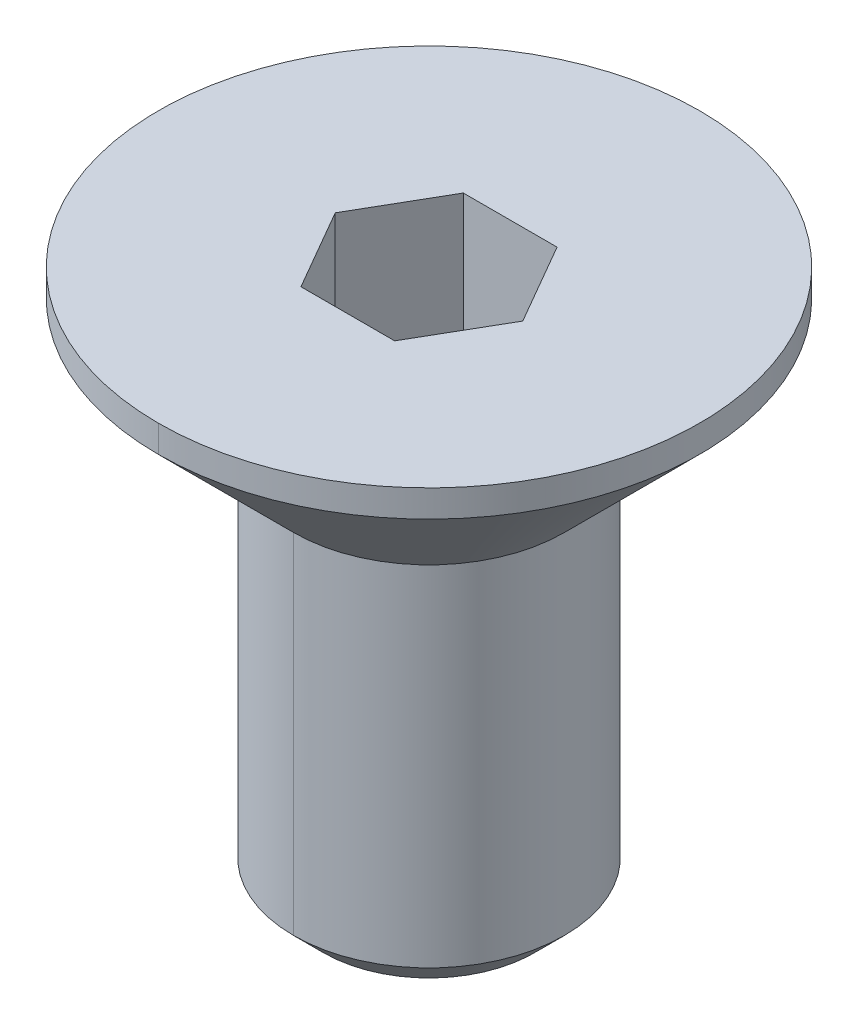
ISO-10303-21;
HEADER;
FILE_DESCRIPTION(('STEP AP214'),'2;1');
FILE_NAME('part.step','',(''),(''),'','','');
FILE_SCHEMA(('AUTOMOTIVE_DESIGN { 1 0 10303 214 1 1 1 1 }'));
ENDSEC;
DATA;
#1=APPLICATION_CONTEXT('core data for automotive mechanical design processes');
#2=APPLICATION_PROTOCOL_DEFINITION('international standard','automotive_design',2000,#1);
#3=PRODUCT_CONTEXT('',#1,'mechanical');
#4=PRODUCT('Part','Part','',(#3));
#5=PRODUCT_RELATED_PRODUCT_CATEGORY('part','',(#4));
#6=PRODUCT_DEFINITION_FORMATION('','',#4);
#7=PRODUCT_DEFINITION_CONTEXT('part definition',#1,'design');
#8=PRODUCT_DEFINITION('design','',#6,#7);
#9=PRODUCT_DEFINITION_SHAPE('','',#8);
#10=(LENGTH_UNIT() NAMED_UNIT(*) SI_UNIT(.MILLI.,.METRE.));
#11=(NAMED_UNIT(*) PLANE_ANGLE_UNIT() SI_UNIT($,.RADIAN.));
#12=(NAMED_UNIT(*) SI_UNIT($,.STERADIAN.) SOLID_ANGLE_UNIT());
#13=UNCERTAINTY_MEASURE_WITH_UNIT(LENGTH_MEASURE(1.E-05),#10,'distance_accuracy_value','');
#14=(GEOMETRIC_REPRESENTATION_CONTEXT(3) GLOBAL_UNCERTAINTY_ASSIGNED_CONTEXT((#13)) GLOBAL_UNIT_ASSIGNED_CONTEXT((#10,
#11,#12)) REPRESENTATION_CONTEXT('',''));
#15=CARTESIAN_POINT('',(0.,0.,0.));
#16=DIRECTION('',(0.,0.,1.));
#17=DIRECTION('',(1.,0.,0.));
#18=AXIS2_PLACEMENT_3D('',#15,#16,#17);
#19=CARTESIAN_POINT('',(9.875,143.526049999998,17.1040017247427));
#20=DIRECTION('',(0.,1.,0.));
#21=DIRECTION('',(0.,0.,-1.));
#22=AXIS2_PLACEMENT_3D('',#19,#20,#21);
#23=CYLINDRICAL_SURFACE('',#22,2.5);
#24=CARTESIAN_POINT('',(9.875,148.276049999998,17.1040017247427));
#25=DIRECTION('',(0.,1.,0.));
#26=DIRECTION('',(0.,0.,-1.));
#27=AXIS2_PLACEMENT_3D('',#24,#25,#26);
#28=CIRCLE('',#27,2.5);
#29=CARTESIAN_POINT('',(9.875,148.276049999998,14.6040017247426));
#30=VERTEX_POINT('',#29);
#31=CARTESIAN_POINT('',(9.875,148.276049999998,19.6040017247427));
#32=VERTEX_POINT('',#31);
#33=EDGE_CURVE('E240',#30,#32,#28,.T.);
#34=ORIENTED_EDGE('',*,*,#33,.T.);
#35=DIRECTION('',(0.,1.,0.));
#36=VECTOR('',#35,1.);
#37=CARTESIAN_POINT('',(9.875,143.526049999998,19.6040017247427));
#38=LINE('',#37,#36);
#39=CARTESIAN_POINT('',(9.875,148.526049999998,19.6040017247427));
#40=VERTEX_POINT('',#39);
#41=EDGE_CURVE('E224',#32,#40,#38,.T.);
#42=ORIENTED_EDGE('',*,*,#41,.T.);
#43=CARTESIAN_POINT('',(9.875,148.526049999998,17.1040017247427));
#44=DIRECTION('',(0.,1.,0.));
#45=DIRECTION('',(0.,0.,-1.));
#46=AXIS2_PLACEMENT_3D('',#43,#44,#45);
#47=CIRCLE('',#46,2.5);
#48=CARTESIAN_POINT('',(9.875,148.526049999998,14.6040017247426));
#49=VERTEX_POINT('',#48);
#50=EDGE_CURVE('E210',#49,#40,#47,.T.);
#51=ORIENTED_EDGE('',*,*,#50,.F.);
#52=DIRECTION('',(0.,1.,0.));
#53=VECTOR('',#52,1.);
#54=CARTESIAN_POINT('',(9.875,143.526049999998,14.6040017247426));
#55=LINE('',#54,#53);
#56=EDGE_CURVE('E236',#30,#49,#55,.T.);
#57=ORIENTED_EDGE('',*,*,#56,.F.);
#58=EDGE_LOOP('',(#34,#42,#51,#57));
#59=FACE_BOUND('',#58,.T.);
#60=ADVANCED_FACE('F17',(#59),#23,.T.);
#61=CARTESIAN_POINT('',(9.875,148.276049999998,17.1040017247427));
#62=DIRECTION('',(0.,1.,0.));
#63=DIRECTION('',(0.,0.,1.));
#64=AXIS2_PLACEMENT_3D('',#61,#62,#63);
#65=CONICAL_SURFACE('',#64,2.5,0.785398163397449);
#66=CARTESIAN_POINT('',(9.875,147.026049999998,17.1040017247427));
#67=DIRECTION('',(0.,1.,0.));
#68=DIRECTION('',(0.,0.,-1.));
#69=AXIS2_PLACEMENT_3D('',#66,#67,#68);
#70=CIRCLE('',#69,1.25);
#71=CARTESIAN_POINT('',(9.875,147.026049999998,18.3540017247426));
#72=VERTEX_POINT('',#71);
#73=CARTESIAN_POINT('',(9.875,147.026049999998,15.8540017247427));
#74=VERTEX_POINT('',#73);
#75=EDGE_CURVE('E265',#72,#74,#70,.T.);
#76=ORIENTED_EDGE('',*,*,#75,.T.);
#77=DIRECTION('',(0.,0.707106781186548,-0.707106781186548));
#78=VECTOR('',#77,1.);
#79=CARTESIAN_POINT('',(9.875,148.276049999998,14.6040017247426));
#80=LINE('',#79,#78);
#81=EDGE_CURVE('E239',#74,#30,#80,.T.);
#82=ORIENTED_EDGE('',*,*,#81,.T.);
#83=CARTESIAN_POINT('',(9.875,148.276049999998,17.1040017247427));
#84=DIRECTION('',(0.,1.,0.));
#85=DIRECTION('',(0.,0.,-1.));
#86=AXIS2_PLACEMENT_3D('',#83,#84,#85);
#87=CIRCLE('',#86,2.5);
#88=EDGE_CURVE('E228',#32,#30,#87,.T.);
#89=ORIENTED_EDGE('',*,*,#88,.F.);
#90=DIRECTION('',(0.,0.707106781186547,0.707106781186549));
#91=VECTOR('',#90,1.);
#92=CARTESIAN_POINT('',(9.875,148.276049999998,19.6040017247427));
#93=LINE('',#92,#91);
#94=EDGE_CURVE('E244',#72,#32,#93,.T.);
#95=ORIENTED_EDGE('',*,*,#94,.F.);
#96=EDGE_LOOP('',(#76,#82,#89,#95));
#97=FACE_BOUND('',#96,.T.);
#98=ADVANCED_FACE('F700',(#97),#65,.T.);
#99=CARTESIAN_POINT('',(9.875,143.526049999998,17.1040017247427));
#100=DIRECTION('',(0.,1.,0.));
#101=DIRECTION('',(0.,0.,-1.));
#102=AXIS2_PLACEMENT_3D('',#99,#100,#101);
#103=CYLINDRICAL_SURFACE('',#102,1.25);
#104=CARTESIAN_POINT('',(9.875,143.802049999998,17.1040017247427));
#105=DIRECTION('',(0.,1.,0.));
#106=DIRECTION('',(0.,0.,-1.));
#107=AXIS2_PLACEMENT_3D('',#104,#105,#106);
#108=CIRCLE('',#107,1.25);
#109=CARTESIAN_POINT('',(9.875,143.802049999998,15.8540017247427));
#110=VERTEX_POINT('',#109);
#111=CARTESIAN_POINT('',(9.875,143.802049999998,18.3540017247426));
#112=VERTEX_POINT('',#111);
#113=EDGE_CURVE('E280',#110,#112,#108,.T.);
#114=ORIENTED_EDGE('',*,*,#113,.T.);
#115=DIRECTION('',(0.,1.,0.));
#116=VECTOR('',#115,1.);
#117=CARTESIAN_POINT('',(9.875,143.526049999998,18.3540017247426));
#118=LINE('',#117,#116);
#119=EDGE_CURVE('E243',#112,#72,#118,.T.);
#120=ORIENTED_EDGE('',*,*,#119,.T.);
#121=CARTESIAN_POINT('',(9.875,147.026049999998,17.1040017247427));
#122=DIRECTION('',(0.,1.,0.));
#123=DIRECTION('',(0.,0.,-1.));
#124=AXIS2_PLACEMENT_3D('',#121,#122,#123);
#125=CIRCLE('',#124,1.25);
#126=EDGE_CURVE('E245',#74,#72,#125,.T.);
#127=ORIENTED_EDGE('',*,*,#126,.F.);
#128=DIRECTION('',(0.,1.,0.));
#129=VECTOR('',#128,1.);
#130=CARTESIAN_POINT('',(9.875,143.526049999998,15.8540017247427));
#131=LINE('',#130,#129);
#132=EDGE_CURVE('E261',#110,#74,#131,.T.);
#133=ORIENTED_EDGE('',*,*,#132,.F.);
#134=EDGE_LOOP('',(#114,#120,#127,#133));
#135=FACE_BOUND('',#134,.T.);
#136=ADVANCED_FACE('F691',(#135),#103,.T.);
#137=CARTESIAN_POINT('',(9.875,143.802049999998,17.1040017247427));
#138=DIRECTION('',(0.,1.,0.));
#139=DIRECTION('',(0.,0.,1.));
#140=AXIS2_PLACEMENT_3D('',#137,#138,#139);
#141=CONICAL_SURFACE('',#140,1.25,0.785398163397449);
#142=CARTESIAN_POINT('',(9.875,143.526049999998,17.1040017247427));
#143=DIRECTION('',(0.,1.,0.));
#144=DIRECTION('',(0.,0.,-1.));
#145=AXIS2_PLACEMENT_3D('',#142,#143,#144);
#146=CIRCLE('',#145,0.974);
#147=CARTESIAN_POINT('',(9.875,143.526049999998,18.0780017247427));
#148=VERTEX_POINT('',#147);
#149=CARTESIAN_POINT('',(9.875,143.526049999998,16.1300017247426));
#150=VERTEX_POINT('',#149);
#151=EDGE_CURVE('E283',#148,#150,#146,.T.);
#152=ORIENTED_EDGE('',*,*,#151,.T.);
#153=DIRECTION('',(0.,0.707106781186548,-0.707106781186548));
#154=VECTOR('',#153,1.);
#155=CARTESIAN_POINT('',(9.875,143.802049999998,15.8540017247427));
#156=LINE('',#155,#154);
#157=EDGE_CURVE('E268',#150,#110,#156,.T.);
#158=ORIENTED_EDGE('',*,*,#157,.T.);
#159=CARTESIAN_POINT('',(9.875,143.802049999998,17.1040017247427));
#160=DIRECTION('',(0.,1.,0.));
#161=DIRECTION('',(0.,0.,-1.));
#162=AXIS2_PLACEMENT_3D('',#159,#160,#161);
#163=CIRCLE('',#162,1.25);
#164=EDGE_CURVE('E257',#112,#110,#163,.T.);
#165=ORIENTED_EDGE('',*,*,#164,.F.);
#166=DIRECTION('',(0.,0.707106781186547,0.707106781186549));
#167=VECTOR('',#166,1.);
#168=CARTESIAN_POINT('',(9.875,143.802049999998,18.3540017247426));
#169=LINE('',#168,#167);
#170=EDGE_CURVE('E276',#148,#112,#169,.T.);
#171=ORIENTED_EDGE('',*,*,#170,.F.);
#172=EDGE_LOOP('',(#152,#158,#165,#171));
#173=FACE_BOUND('',#172,.T.);
#174=ADVANCED_FACE('F683',(#173),#141,.T.);
#175=CARTESIAN_POINT('',(9.875,405.845095102518,17.1040017247429));
#176=DIRECTION('',(0.,1.,0.));
#177=DIRECTION('',(0.,0.,1.));
#178=AXIS2_PLACEMENT_3D('',#175,#176,#177);
#179=CONICAL_SURFACE('',#178,965.925826289068,1.30899693899575);
#180=DIRECTION('',(0.,0.258819045102518,0.965925826289069));
#181=VECTOR('',#180,1.);
#182=CARTESIAN_POINT('',(9.875,405.845095102518,983.029828013811));
#183=LINE('',#182,#181);
#184=CARTESIAN_POINT('',(9.875,147.026049999998,17.1040017247427));
#185=VERTEX_POINT('',#184);
#186=CARTESIAN_POINT('',(9.875,147.227011894321,17.8540017247426));
#187=VERTEX_POINT('',#186);
#188=EDGE_CURVE('E38',#185,#187,#183,.T.);
#189=ORIENTED_EDGE('',*,*,#188,.F.);
#190=DIRECTION('',(0.,0.258819045102519,-0.965925826289069));
#191=VECTOR('',#190,1.);
#192=CARTESIAN_POINT('',(9.875,405.84509510252,-948.821824564325));
#193=LINE('',#192,#191);
#194=CARTESIAN_POINT('',(9.875,147.227011894321,16.3540017247427));
#195=VERTEX_POINT('',#194);
#196=EDGE_CURVE('E308',#185,#195,#193,.T.);
#197=ORIENTED_EDGE('',*,*,#196,.T.);
#198=CARTESIAN_POINT('',(9.875,147.227011894321,17.1040017247427));
#199=DIRECTION('',(0.,1.,0.));
#200=DIRECTION('',(0.,0.,-1.));
#201=AXIS2_PLACEMENT_3D('',#198,#199,#200);
#202=CIRCLE('',#201,0.75);
#203=CARTESIAN_POINT('',(9.22548094716169,147.227011894321,16.7290017247427));
#204=VERTEX_POINT('',#203);
#205=EDGE_CURVE('E11',#195,#204,#202,.T.);
#206=ORIENTED_EDGE('',*,*,#205,.T.);
#207=CARTESIAN_POINT('',(9.875,147.227011894321,17.1040017247427));
#208=DIRECTION('',(0.,1.,0.));
#209=DIRECTION('',(0.,0.,-1.));
#210=AXIS2_PLACEMENT_3D('',#207,#208,#209);
#211=CIRCLE('',#210,0.75);
#212=CARTESIAN_POINT('',(9.22548094716169,147.227011894321,17.4790017247427));
#213=VERTEX_POINT('',#212);
#214=EDGE_CURVE('E201',#204,#213,#211,.T.);
#215=ORIENTED_EDGE('',*,*,#214,.T.);
#216=CARTESIAN_POINT('',(9.875,147.227011894321,17.1040017247427));
#217=DIRECTION('',(0.,1.,0.));
#218=DIRECTION('',(0.,0.,-1.));
#219=AXIS2_PLACEMENT_3D('',#216,#217,#218);
#220=CIRCLE('',#219,0.75);
#221=EDGE_CURVE('E345',#213,#187,#220,.T.);
#222=ORIENTED_EDGE('',*,*,#221,.T.);
#223=EDGE_LOOP('',(#189,#197,#206,#215,#222));
#224=FACE_BOUND('',#223,.T.);
#225=ADVANCED_FACE('F317',(#224),#179,.F.);
#226=CARTESIAN_POINT('',(9.875,147.227011894321,17.1040017247427));
#227=DIRECTION('',(0.,-1.,0.));
#228=DIRECTION('',(0.,0.,-1.));
#229=AXIS2_PLACEMENT_3D('',#226,#227,#228);
#230=PLANE('',#229);
#231=DIRECTION('',(-0.5,0.,-0.866025403784439));
#232=VECTOR('',#231,1.);
#233=CARTESIAN_POINT('',(10.7410254037845,147.227011894321,17.1040017247427));
#234=LINE('',#233,#232);
#235=CARTESIAN_POINT('',(10.7410254037845,147.227011894321,17.1040017247427));
#236=VERTEX_POINT('',#235);
#237=CARTESIAN_POINT('',(10.5245190528383,147.227011894321,16.7290017247427));
#238=VERTEX_POINT('',#237);
#239=EDGE_CURVE('E166',#236,#238,#234,.T.);
#240=ORIENTED_EDGE('',*,*,#239,.T.);
#241=CARTESIAN_POINT('',(9.875,147.227011894321,17.1040017247427));
#242=DIRECTION('',(0.,1.,0.));
#243=DIRECTION('',(0.,0.,-1.));
#244=AXIS2_PLACEMENT_3D('',#241,#242,#243);
#245=CIRCLE('',#244,0.75);
#246=CARTESIAN_POINT('',(10.5245190528383,147.227011894321,17.4790017247427));
#247=VERTEX_POINT('',#246);
#248=EDGE_CURVE('E161',#247,#238,#245,.T.);
#249=ORIENTED_EDGE('',*,*,#248,.F.);
#250=DIRECTION('',(0.5,0.,-0.866025403784439));
#251=VECTOR('',#250,1.);
#252=CARTESIAN_POINT('',(10.3080127018922,147.227011894321,17.8540017247426));
#253=LINE('',#252,#251);
#254=EDGE_CURVE('E164',#247,#236,#253,.T.);
#255=ORIENTED_EDGE('',*,*,#254,.T.);
#256=EDGE_LOOP('',(#240,#249,#255));
#257=FACE_BOUND('',#256,.T.);
#258=ADVANCED_FACE('F163',(#257),#230,.F.);
#259=CARTESIAN_POINT('',(9.875,147.227011894321,17.1040017247427));
#260=DIRECTION('',(0.,-1.,0.));
#261=DIRECTION('',(0.,0.,-1.));
#262=AXIS2_PLACEMENT_3D('',#259,#260,#261);
#263=PLANE('',#262);
#264=DIRECTION('',(-1.,0.,0.));
#265=VECTOR('',#264,1.);
#266=CARTESIAN_POINT('',(10.3080127018922,147.227011894321,16.3540017247427));
#267=LINE('',#266,#265);
#268=CARTESIAN_POINT('',(10.3080127018922,147.227011894321,16.3540017247427));
#269=VERTEX_POINT('',#268);
#270=EDGE_CURVE('E300',#269,#195,#267,.T.);
#271=ORIENTED_EDGE('',*,*,#270,.T.);
#272=CARTESIAN_POINT('',(9.875,147.227011894321,17.1040017247427));
#273=DIRECTION('',(0.,1.,0.));
#274=DIRECTION('',(0.,0.,-1.));
#275=AXIS2_PLACEMENT_3D('',#272,#273,#274);
#276=CIRCLE('',#275,0.75);
#277=EDGE_CURVE('E25',#238,#195,#276,.T.);
#278=ORIENTED_EDGE('',*,*,#277,.F.);
#279=DIRECTION('',(-0.5,0.,-0.866025403784439));
#280=VECTOR('',#279,1.);
#281=CARTESIAN_POINT('',(10.7410254037845,147.227011894321,17.1040017247427));
#282=LINE('',#281,#280);
#283=EDGE_CURVE('E296',#238,#269,#282,.T.);
#284=ORIENTED_EDGE('',*,*,#283,.T.);
#285=EDGE_LOOP('',(#271,#278,#284));
#286=FACE_BOUND('',#285,.T.);
#287=ADVANCED_FACE('F323',(#286),#263,.F.);
#288=CARTESIAN_POINT('',(9.875,147.227011894321,17.1040017247427));
#289=DIRECTION('',(0.,-1.,0.));
#290=DIRECTION('',(0.,0.,-1.));
#291=AXIS2_PLACEMENT_3D('',#288,#289,#290);
#292=PLANE('',#291);
#293=DIRECTION('',(-0.5,0.,0.866025403784439));
#294=VECTOR('',#293,1.);
#295=CARTESIAN_POINT('',(9.4419872981078,147.227011894321,16.3540017247427));
#296=LINE('',#295,#294);
#297=CARTESIAN_POINT('',(9.4419872981078,147.227011894321,16.3540017247427));
#298=VERTEX_POINT('',#297);
#299=EDGE_CURVE('E49',#298,#204,#296,.T.);
#300=ORIENTED_EDGE('',*,*,#299,.T.);
#301=ORIENTED_EDGE('',*,*,#205,.F.);
#302=DIRECTION('',(-1.,0.,0.));
#303=VECTOR('',#302,1.);
#304=CARTESIAN_POINT('',(10.3080127018922,147.227011894321,16.3540017247427));
#305=LINE('',#304,#303);
#306=EDGE_CURVE('E211',#195,#298,#305,.T.);
#307=ORIENTED_EDGE('',*,*,#306,.T.);
#308=EDGE_LOOP('',(#300,#301,#307));
#309=FACE_BOUND('',#308,.T.);
#310=ADVANCED_FACE('F593',(#309),#292,.F.);
#311=CARTESIAN_POINT('',(9.875,405.845095102518,17.1040017247429));
#312=DIRECTION('',(0.,1.,0.));
#313=DIRECTION('',(0.,0.,1.));
#314=AXIS2_PLACEMENT_3D('',#311,#312,#313);
#315=CONICAL_SURFACE('',#314,965.925826289068,1.30899693899575);
#316=ORIENTED_EDGE('',*,*,#196,.F.);
#317=ORIENTED_EDGE('',*,*,#188,.T.);
#318=CARTESIAN_POINT('',(9.875,147.227011894321,17.1040017247427));
#319=DIRECTION('',(0.,1.,0.));
#320=DIRECTION('',(0.,0.,-1.));
#321=AXIS2_PLACEMENT_3D('',#318,#319,#320);
#322=CIRCLE('',#321,0.75);
#323=EDGE_CURVE('E183',#187,#247,#322,.T.);
#324=ORIENTED_EDGE('',*,*,#323,.T.);
#325=ORIENTED_EDGE('',*,*,#248,.T.);
#326=ORIENTED_EDGE('',*,*,#277,.T.);
#327=EDGE_LOOP('',(#316,#317,#324,#325,#326));
#328=FACE_BOUND('',#327,.T.);
#329=ADVANCED_FACE('F184',(#328),#315,.F.);
#330=CARTESIAN_POINT('',(9.00897459621558,147.227011894321,17.1040017247427));
#331=DIRECTION('',(0.866025403784439,0.,-0.5));
#332=DIRECTION('',(0.,-1.,0.));
#333=AXIS2_PLACEMENT_3D('',#330,#331,#332);
#334=PLANE('',#333);
#335=DIRECTION('',(0.5,0.,0.866025403784439));
#336=VECTOR('',#335,1.);
#337=CARTESIAN_POINT('',(9.00897459621558,147.227011894321,17.1040017247427));
#338=LINE('',#337,#336);
#339=CARTESIAN_POINT('',(9.00897459621558,147.227011894321,17.1040017247427));
#340=VERTEX_POINT('',#339);
#341=EDGE_CURVE('E359',#340,#213,#338,.T.);
#342=ORIENTED_EDGE('',*,*,#341,.F.);
#343=DIRECTION('',(0.,1.,0.));
#344=VECTOR('',#343,1.);
#345=CARTESIAN_POINT('',(9.00897459621558,147.227011894321,17.1040017247427));
#346=LINE('',#345,#344);
#347=CARTESIAN_POINT('',(9.00897459621558,148.526049999998,17.1040017247427));
#348=VERTEX_POINT('',#347);
#349=EDGE_CURVE('E286',#340,#348,#346,.T.);
#350=ORIENTED_EDGE('',*,*,#349,.T.);
#351=DIRECTION('',(-0.5,0.,-0.866025403784439));
#352=VECTOR('',#351,1.);
#353=CARTESIAN_POINT('',(9.03798094716169,148.526049999998,17.1542421983235));
#354=LINE('',#353,#352);
#355=CARTESIAN_POINT('',(9.4419872981078,148.526049999998,17.8540017247426));
#356=VERTEX_POINT('',#355);
#357=EDGE_CURVE('E219',#356,#348,#354,.T.);
#358=ORIENTED_EDGE('',*,*,#357,.F.);
#359=DIRECTION('',(0.,1.,0.));
#360=VECTOR('',#359,1.);
#361=CARTESIAN_POINT('',(9.4419872981078,147.227011894321,17.8540017247426));
#362=LINE('',#361,#360);
#363=CARTESIAN_POINT('',(9.4419872981078,147.227011894321,17.8540017247426));
#364=VERTEX_POINT('',#363);
#365=EDGE_CURVE('E232',#364,#356,#362,.T.);
#366=ORIENTED_EDGE('',*,*,#365,.F.);
#367=DIRECTION('',(0.5,0.,0.866025403784439));
#368=VECTOR('',#367,1.);
#369=CARTESIAN_POINT('',(9.00897459621558,147.227011894321,17.1040017247427));
#370=LINE('',#369,#368);
#371=EDGE_CURVE('E355',#213,#364,#370,.T.);
#372=ORIENTED_EDGE('',*,*,#371,.F.);
#373=EDGE_LOOP('',(#342,#350,#358,#366,#372));
#374=FACE_BOUND('',#373,.T.);
#375=ADVANCED_FACE('F537',(#374),#334,.T.);
#376=CARTESIAN_POINT('',(9.4419872981078,147.227011894321,16.3540017247427));
#377=DIRECTION('',(0.866025403784439,0.,0.5));
#378=DIRECTION('',(0.,-1.,0.));
#379=AXIS2_PLACEMENT_3D('',#376,#377,#378);
#380=PLANE('',#379);
#381=ORIENTED_EDGE('',*,*,#299,.F.);
#382=DIRECTION('',(0.,1.,0.));
#383=VECTOR('',#382,1.);
#384=CARTESIAN_POINT('',(9.4419872981078,147.227011894321,16.3540017247427));
#385=LINE('',#384,#383);
#386=CARTESIAN_POINT('',(9.4419872981078,148.526049999998,16.3540017247427));
#387=VERTEX_POINT('',#386);
#388=EDGE_CURVE('E213',#298,#387,#385,.T.);
#389=ORIENTED_EDGE('',*,*,#388,.T.);
#390=DIRECTION('',(0.5,0.,-0.866025403784439));
#391=VECTOR('',#390,1.);
#392=CARTESIAN_POINT('',(9.03798094716169,148.526049999998,17.0537612511618));
#393=LINE('',#392,#391);
#394=EDGE_CURVE('E225',#348,#387,#393,.T.);
#395=ORIENTED_EDGE('',*,*,#394,.F.);
#396=ORIENTED_EDGE('',*,*,#349,.F.);
#397=DIRECTION('',(-0.5,0.,0.866025403784439));
#398=VECTOR('',#397,1.);
#399=CARTESIAN_POINT('',(9.4419872981078,147.227011894321,16.3540017247427));
#400=LINE('',#399,#398);
#401=EDGE_CURVE('E193',#204,#340,#400,.T.);
#402=ORIENTED_EDGE('',*,*,#401,.F.);
#403=EDGE_LOOP('',(#381,#389,#395,#396,#402));
#404=FACE_BOUND('',#403,.T.);
#405=ADVANCED_FACE('F533',(#404),#380,.T.);
#406=CARTESIAN_POINT('',(10.3080127018922,147.227011894321,16.3540017247427));
#407=DIRECTION('',(0.,0.,1.));
#408=DIRECTION('',(0.,-1.,0.));
#409=AXIS2_PLACEMENT_3D('',#406,#407,#408);
#410=PLANE('',#409);
#411=ORIENTED_EDGE('',*,*,#270,.F.);
#412=DIRECTION('',(0.,1.,0.));
#413=VECTOR('',#412,1.);
#414=CARTESIAN_POINT('',(10.3080127018922,147.227011894321,16.3540017247427));
#415=LINE('',#414,#413);
#416=CARTESIAN_POINT('',(10.3080127018922,148.526049999998,16.3540017247427));
#417=VERTEX_POINT('',#416);
#418=EDGE_CURVE('E293',#269,#417,#415,.T.);
#419=ORIENTED_EDGE('',*,*,#418,.T.);
#420=DIRECTION('',(1.,0.,0.));
#421=VECTOR('',#420,1.);
#422=CARTESIAN_POINT('',(9.125,148.526049999998,16.3540017247427));
#423=LINE('',#422,#421);
#424=EDGE_CURVE('E220',#387,#417,#423,.T.);
#425=ORIENTED_EDGE('',*,*,#424,.F.);
#426=ORIENTED_EDGE('',*,*,#388,.F.);
#427=ORIENTED_EDGE('',*,*,#306,.F.);
#428=EDGE_LOOP('',(#411,#419,#425,#426,#427));
#429=FACE_BOUND('',#428,.T.);
#430=ADVANCED_FACE('F320',(#429),#410,.T.);
#431=CARTESIAN_POINT('',(10.7410254037845,147.227011894321,17.1040017247427));
#432=DIRECTION('',(-0.866025403784439,0.,0.5));
#433=DIRECTION('',(0.,1.,0.));
#434=AXIS2_PLACEMENT_3D('',#431,#432,#433);
#435=PLANE('',#434);
#436=ORIENTED_EDGE('',*,*,#239,.F.);
#437=DIRECTION('',(0.,1.,0.));
#438=VECTOR('',#437,1.);
#439=CARTESIAN_POINT('',(10.7410254037845,147.227011894321,17.1040017247427));
#440=LINE('',#439,#438);
#441=CARTESIAN_POINT('',(10.7410254037845,148.526049999998,17.1040017247427));
#442=VERTEX_POINT('',#441);
#443=EDGE_CURVE('E179',#236,#442,#440,.T.);
#444=ORIENTED_EDGE('',*,*,#443,.T.);
#445=DIRECTION('',(0.5,0.,0.866025403784439));
#446=VECTOR('',#445,1.);
#447=CARTESIAN_POINT('',(10.3370190528383,148.526049999998,16.4042421983235));
#448=LINE('',#447,#446);
#449=EDGE_CURVE('E209',#417,#442,#448,.T.);
#450=ORIENTED_EDGE('',*,*,#449,.F.);
#451=ORIENTED_EDGE('',*,*,#418,.F.);
#452=ORIENTED_EDGE('',*,*,#283,.F.);
#453=EDGE_LOOP('',(#436,#444,#450,#451,#452));
#454=FACE_BOUND('',#453,.T.);
#455=ADVANCED_FACE('F327',(#454),#435,.T.);
#456=CARTESIAN_POINT('',(10.3080127018922,147.227011894321,17.8540017247426));
#457=DIRECTION('',(-0.866025403784439,0.,-0.5));
#458=DIRECTION('',(-0.5,0.,0.866025403784439));
#459=AXIS2_PLACEMENT_3D('',#456,#457,#458);
#460=PLANE('',#459);
#461=DIRECTION('',(0.5,0.,-0.866025403784439));
#462=VECTOR('',#461,1.);
#463=CARTESIAN_POINT('',(10.3080127018922,147.227011894321,17.8540017247426));
#464=LINE('',#463,#462);
#465=CARTESIAN_POINT('',(10.3080127018922,147.227011894321,17.8540017247426));
#466=VERTEX_POINT('',#465);
#467=EDGE_CURVE('E177',#466,#247,#464,.T.);
#468=ORIENTED_EDGE('',*,*,#467,.F.);
#469=DIRECTION('',(0.,1.,0.));
#470=VECTOR('',#469,1.);
#471=CARTESIAN_POINT('',(10.3080127018922,147.227011894321,17.8540017247426));
#472=LINE('',#471,#470);
#473=CARTESIAN_POINT('',(10.3080127018922,148.526049999998,17.8540017247426));
#474=VERTEX_POINT('',#473);
#475=EDGE_CURVE('E229',#466,#474,#472,.T.);
#476=ORIENTED_EDGE('',*,*,#475,.T.);
#477=DIRECTION('',(-0.5,0.,0.866025403784439));
#478=VECTOR('',#477,1.);
#479=CARTESIAN_POINT('',(10.3370190528383,148.526049999998,17.8037612511618));
#480=LINE('',#479,#478);
#481=EDGE_CURVE('E205',#442,#474,#480,.T.);
#482=ORIENTED_EDGE('',*,*,#481,.F.);
#483=ORIENTED_EDGE('',*,*,#443,.F.);
#484=ORIENTED_EDGE('',*,*,#254,.F.);
#485=EDGE_LOOP('',(#468,#476,#482,#483,#484));
#486=FACE_BOUND('',#485,.T.);
#487=ADVANCED_FACE('F175',(#486),#460,.T.);
#488=CARTESIAN_POINT('',(9.4419872981078,147.227011894321,17.8540017247426));
#489=DIRECTION('',(0.,0.,-1.));
#490=DIRECTION('',(-1.,0.,0.));
#491=AXIS2_PLACEMENT_3D('',#488,#489,#490);
#492=PLANE('',#491);
#493=DIRECTION('',(1.,0.,0.));
#494=VECTOR('',#493,1.);
#495=CARTESIAN_POINT('',(9.4419872981078,147.227011894321,17.8540017247426));
#496=LINE('',#495,#494);
#497=EDGE_CURVE('E376',#364,#187,#496,.T.);
#498=ORIENTED_EDGE('',*,*,#497,.F.);
#499=ORIENTED_EDGE('',*,*,#365,.T.);
#500=DIRECTION('',(-1.,0.,0.));
#501=VECTOR('',#500,1.);
#502=CARTESIAN_POINT('',(9.125,148.526049999998,17.8540017247426));
#503=LINE('',#502,#501);
#504=EDGE_CURVE('E215',#474,#356,#503,.T.);
#505=ORIENTED_EDGE('',*,*,#504,.F.);
#506=ORIENTED_EDGE('',*,*,#475,.F.);
#507=DIRECTION('',(1.,0.,0.));
#508=VECTOR('',#507,1.);
#509=CARTESIAN_POINT('',(9.4419872981078,147.227011894321,17.8540017247426));
#510=LINE('',#509,#508);
#511=EDGE_CURVE('E189',#187,#466,#510,.T.);
#512=ORIENTED_EDGE('',*,*,#511,.F.);
#513=EDGE_LOOP('',(#498,#499,#505,#506,#512));
#514=FACE_BOUND('',#513,.T.);
#515=ADVANCED_FACE('F388',(#514),#492,.T.);
#516=CARTESIAN_POINT('',(8.901,143.526049999998,17.1040017247427));
#517=DIRECTION('',(0.,1.,0.));
#518=DIRECTION('',(0.,0.,-1.));
#519=AXIS2_PLACEMENT_3D('',#516,#517,#518);
#520=PLANE('',#519);
#521=ORIENTED_EDGE('',*,*,#151,.F.);
#522=CARTESIAN_POINT('',(9.875,143.526049999998,17.1040017247427));
#523=DIRECTION('',(0.,1.,0.));
#524=DIRECTION('',(0.,0.,-1.));
#525=AXIS2_PLACEMENT_3D('',#522,#523,#524);
#526=CIRCLE('',#525,0.974);
#527=EDGE_CURVE('E272',#150,#148,#526,.T.);
#528=ORIENTED_EDGE('',*,*,#527,.F.);
#529=EDGE_LOOP('',(#521,#528));
#530=FACE_BOUND('',#529,.T.);
#531=ADVANCED_FACE('F608',(#530),#520,.F.);
#532=CARTESIAN_POINT('',(9.875,143.802049999998,17.1040017247427));
#533=DIRECTION('',(0.,1.,0.));
#534=DIRECTION('',(0.,0.,1.));
#535=AXIS2_PLACEMENT_3D('',#532,#533,#534);
#536=CONICAL_SURFACE('',#535,1.25,0.785398163397449);
#537=ORIENTED_EDGE('',*,*,#157,.F.);
#538=ORIENTED_EDGE('',*,*,#527,.T.);
#539=ORIENTED_EDGE('',*,*,#170,.T.);
#540=ORIENTED_EDGE('',*,*,#113,.F.);
#541=EDGE_LOOP('',(#537,#538,#539,#540));
#542=FACE_BOUND('',#541,.T.);
#543=ADVANCED_FACE('F623',(#542),#536,.T.);
#544=CARTESIAN_POINT('',(9.875,143.526049999998,17.1040017247427));
#545=DIRECTION('',(0.,1.,0.));
#546=DIRECTION('',(0.,0.,-1.));
#547=AXIS2_PLACEMENT_3D('',#544,#545,#546);
#548=CYLINDRICAL_SURFACE('',#547,1.25);
#549=ORIENTED_EDGE('',*,*,#119,.F.);
#550=ORIENTED_EDGE('',*,*,#164,.T.);
#551=ORIENTED_EDGE('',*,*,#132,.T.);
#552=ORIENTED_EDGE('',*,*,#75,.F.);
#553=EDGE_LOOP('',(#549,#550,#551,#552));
#554=FACE_BOUND('',#553,.T.);
#555=ADVANCED_FACE('F584',(#554),#548,.T.);
#556=CARTESIAN_POINT('',(9.875,148.276049999998,17.1040017247427));
#557=DIRECTION('',(0.,1.,0.));
#558=DIRECTION('',(0.,0.,1.));
#559=AXIS2_PLACEMENT_3D('',#556,#557,#558);
#560=CONICAL_SURFACE('',#559,2.5,0.785398163397449);
#561=ORIENTED_EDGE('',*,*,#81,.F.);
#562=ORIENTED_EDGE('',*,*,#126,.T.);
#563=ORIENTED_EDGE('',*,*,#94,.T.);
#564=ORIENTED_EDGE('',*,*,#33,.F.);
#565=EDGE_LOOP('',(#561,#562,#563,#564));
#566=FACE_BOUND('',#565,.T.);
#567=ADVANCED_FACE('F561',(#566),#560,.T.);
#568=CARTESIAN_POINT('',(9.875,143.526049999998,17.1040017247427));
#569=DIRECTION('',(0.,1.,0.));
#570=DIRECTION('',(0.,0.,-1.));
#571=AXIS2_PLACEMENT_3D('',#568,#569,#570);
#572=CYLINDRICAL_SURFACE('',#571,2.5);
#573=ORIENTED_EDGE('',*,*,#41,.F.);
#574=ORIENTED_EDGE('',*,*,#88,.T.);
#575=ORIENTED_EDGE('',*,*,#56,.T.);
#576=CARTESIAN_POINT('',(9.875,148.526049999998,17.1040017247427));
#577=DIRECTION('',(0.,1.,0.));
#578=DIRECTION('',(0.,0.,-1.));
#579=AXIS2_PLACEMENT_3D('',#576,#577,#578);
#580=CIRCLE('',#579,2.5);
#581=EDGE_CURVE('E206',#40,#49,#580,.T.);
#582=ORIENTED_EDGE('',*,*,#581,.F.);
#583=EDGE_LOOP('',(#573,#574,#575,#582));
#584=FACE_BOUND('',#583,.T.);
#585=ADVANCED_FACE('F557',(#584),#572,.T.);
#586=CARTESIAN_POINT('',(9.125,148.526049999998,17.1040017247427));
#587=DIRECTION('',(0.,-1.,0.));
#588=DIRECTION('',(0.,0.,-1.));
#589=AXIS2_PLACEMENT_3D('',#586,#587,#588);
#590=PLANE('',#589);
#591=ORIENTED_EDGE('',*,*,#449,.T.);
#592=ORIENTED_EDGE('',*,*,#481,.T.);
#593=ORIENTED_EDGE('',*,*,#504,.T.);
#594=ORIENTED_EDGE('',*,*,#357,.T.);
#595=ORIENTED_EDGE('',*,*,#394,.T.);
#596=ORIENTED_EDGE('',*,*,#424,.T.);
#597=EDGE_LOOP('',(#591,#592,#593,#594,#595,#596));
#598=FACE_BOUND('',#597,.T.);
#599=ORIENTED_EDGE('',*,*,#50,.T.);
#600=ORIENTED_EDGE('',*,*,#581,.T.);
#601=EDGE_LOOP('',(#599,#600));
#602=FACE_BOUND('',#601,.T.);
#603=ADVANCED_FACE('F331',(#598,#602),#590,.F.);
#604=CARTESIAN_POINT('',(9.875,147.227011894321,17.1040017247427));
#605=DIRECTION('',(0.,-1.,0.));
#606=DIRECTION('',(0.,0.,-1.));
#607=AXIS2_PLACEMENT_3D('',#604,#605,#606);
#608=PLANE('',#607);
#609=ORIENTED_EDGE('',*,*,#467,.T.);
#610=ORIENTED_EDGE('',*,*,#323,.F.);
#611=ORIENTED_EDGE('',*,*,#511,.T.);
#612=EDGE_LOOP('',(#609,#610,#611));
#613=FACE_BOUND('',#612,.T.);
#614=ADVANCED_FACE('F191',(#613),#608,.F.);
#615=CARTESIAN_POINT('',(9.875,147.227011894321,17.1040017247427));
#616=DIRECTION('',(0.,-1.,0.));
#617=DIRECTION('',(0.,0.,-1.));
#618=AXIS2_PLACEMENT_3D('',#615,#616,#617);
#619=PLANE('',#618);
#620=ORIENTED_EDGE('',*,*,#341,.T.);
#621=ORIENTED_EDGE('',*,*,#214,.F.);
#622=ORIENTED_EDGE('',*,*,#401,.T.);
#623=EDGE_LOOP('',(#620,#621,#622));
#624=FACE_BOUND('',#623,.T.);
#625=ADVANCED_FACE('F545',(#624),#619,.F.);
#626=CARTESIAN_POINT('',(9.875,147.227011894321,17.1040017247427));
#627=DIRECTION('',(0.,-1.,0.));
#628=DIRECTION('',(0.,0.,-1.));
#629=AXIS2_PLACEMENT_3D('',#626,#627,#628);
#630=PLANE('',#629);
#631=ORIENTED_EDGE('',*,*,#497,.T.);
#632=ORIENTED_EDGE('',*,*,#221,.F.);
#633=ORIENTED_EDGE('',*,*,#371,.T.);
#634=EDGE_LOOP('',(#631,#632,#633));
#635=FACE_BOUND('',#634,.T.);
#636=ADVANCED_FACE('F385',(#635),#630,.F.);
#637=CLOSED_SHELL('',(#60,#98,#136,#174,#225,#258,#287,#310,#329,#375,#405,#430,#455,#487,#515,
#531,#543,#555,#567,#585,#603,#614,#625,#636));
#638=MANIFOLD_SOLID_BREP('B1',#637);
#639=ADVANCED_BREP_SHAPE_REPRESENTATION('',(#18,#638),#14);
#640=SHAPE_DEFINITION_REPRESENTATION(#9,#639);
ENDSEC;
END-ISO-10303-21;
